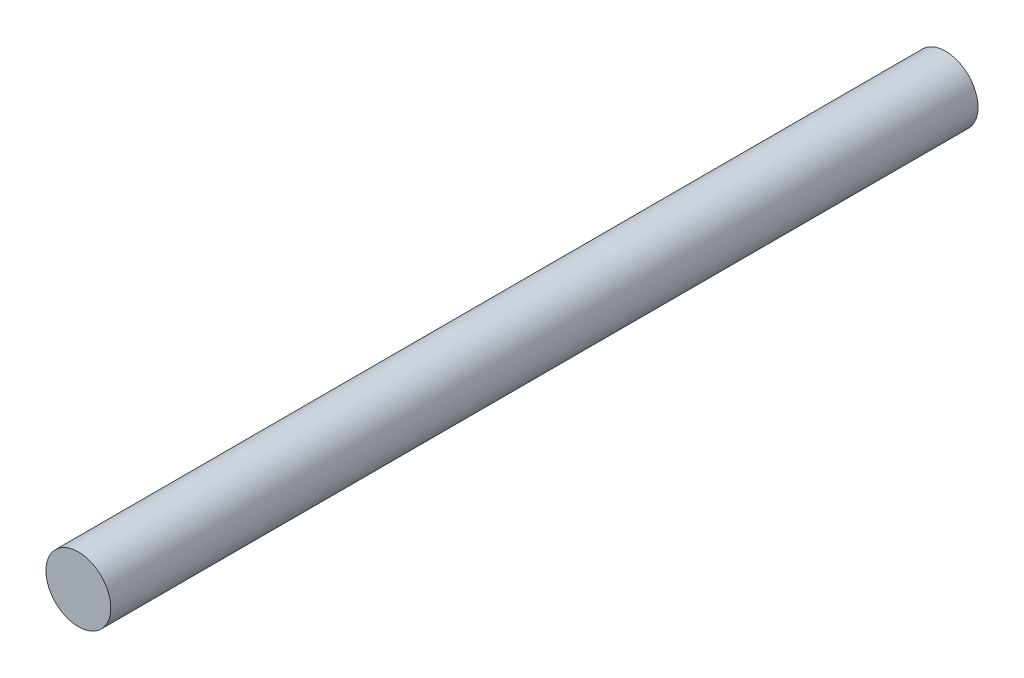
ISO-10303-21;
HEADER;
FILE_DESCRIPTION(('STEP AP214'),'2;1');
FILE_NAME('part.step','',(''),(''),'','','');
FILE_SCHEMA(('AUTOMOTIVE_DESIGN { 1 0 10303 214 1 1 1 1 }'));
ENDSEC;
DATA;
#1=APPLICATION_CONTEXT('core data for automotive mechanical design processes');
#2=APPLICATION_PROTOCOL_DEFINITION('international standard','automotive_design',2000,#1);
#3=PRODUCT_CONTEXT('',#1,'mechanical');
#4=PRODUCT('Part','Part','',(#3));
#5=PRODUCT_RELATED_PRODUCT_CATEGORY('part','',(#4));
#6=PRODUCT_DEFINITION_FORMATION('','',#4);
#7=PRODUCT_DEFINITION_CONTEXT('part definition',#1,'design');
#8=PRODUCT_DEFINITION('design','',#6,#7);
#9=PRODUCT_DEFINITION_SHAPE('','',#8);
#10=(LENGTH_UNIT() NAMED_UNIT(*) SI_UNIT(.MILLI.,.METRE.));
#11=(NAMED_UNIT(*) PLANE_ANGLE_UNIT() SI_UNIT($,.RADIAN.));
#12=(NAMED_UNIT(*) SI_UNIT($,.STERADIAN.) SOLID_ANGLE_UNIT());
#13=UNCERTAINTY_MEASURE_WITH_UNIT(LENGTH_MEASURE(1.E-05),#10,'distance_accuracy_value','');
#14=(GEOMETRIC_REPRESENTATION_CONTEXT(3) GLOBAL_UNCERTAINTY_ASSIGNED_CONTEXT((#13)) GLOBAL_UNIT_ASSIGNED_CONTEXT((#10,
#11,#12)) REPRESENTATION_CONTEXT('',''));
#15=CARTESIAN_POINT('',(0.,0.,0.));
#16=DIRECTION('',(0.,0.,1.));
#17=DIRECTION('',(1.,0.,0.));
#18=AXIS2_PLACEMENT_3D('',#15,#16,#17);
#19=CARTESIAN_POINT('',(0.,0.,107.));
#20=DIRECTION('',(0.,0.,-1.));
#21=DIRECTION('',(-1.,0.,0.));
#22=AXIS2_PLACEMENT_3D('',#19,#20,#21);
#23=CYLINDRICAL_SURFACE('',#22,4.);
#24=CARTESIAN_POINT('',(0.,0.,107.));
#25=DIRECTION('',(0.,0.,1.));
#26=DIRECTION('',(1.,0.,0.));
#27=AXIS2_PLACEMENT_3D('',#24,#25,#26);
#28=CIRCLE('',#27,4.);
#29=CARTESIAN_POINT('',(4.,0.,107.));
#30=VERTEX_POINT('',#29);
#31=EDGE_CURVE('E10',#30,#30,#28,.T.);
#32=ORIENTED_EDGE('',*,*,#31,.F.);
#33=EDGE_LOOP('',(#32));
#34=FACE_BOUND('',#33,.T.);
#35=CARTESIAN_POINT('',(0.,0.,0.));
#36=DIRECTION('',(0.,0.,1.));
#37=DIRECTION('',(1.,0.,0.));
#38=AXIS2_PLACEMENT_3D('',#35,#36,#37);
#39=CIRCLE('',#38,4.);
#40=CARTESIAN_POINT('',(4.,0.,0.));
#41=VERTEX_POINT('',#40);
#42=EDGE_CURVE('E36',#41,#41,#39,.T.);
#43=ORIENTED_EDGE('',*,*,#42,.T.);
#44=EDGE_LOOP('',(#43));
#45=FACE_BOUND('',#44,.T.);
#46=ADVANCED_FACE('F33',(#34,#45),#23,.T.);
#47=CARTESIAN_POINT('',(0.,0.,107.));
#48=DIRECTION('',(0.,0.,1.));
#49=DIRECTION('',(1.,0.,0.));
#50=AXIS2_PLACEMENT_3D('',#47,#48,#49);
#51=PLANE('',#50);
#52=ORIENTED_EDGE('',*,*,#31,.T.);
#53=EDGE_LOOP('',(#52));
#54=FACE_BOUND('',#53,.T.);
#55=ADVANCED_FACE('F48',(#54),#51,.T.);
#56=CARTESIAN_POINT('',(0.,0.,0.));
#57=DIRECTION('',(0.,0.,1.));
#58=DIRECTION('',(1.,0.,0.));
#59=AXIS2_PLACEMENT_3D('',#56,#57,#58);
#60=PLANE('',#59);
#61=ORIENTED_EDGE('',*,*,#42,.F.);
#62=EDGE_LOOP('',(#61));
#63=FACE_BOUND('',#62,.T.);
#64=ADVANCED_FACE('F46',(#63),#60,.F.);
#65=CLOSED_SHELL('',(#46,#55,#64));
#66=MANIFOLD_SOLID_BREP('B2',#65);
#67=ADVANCED_BREP_SHAPE_REPRESENTATION('',(#18,#66),#14);
#68=SHAPE_DEFINITION_REPRESENTATION(#9,#67);
ENDSEC;
END-ISO-10303-21;
